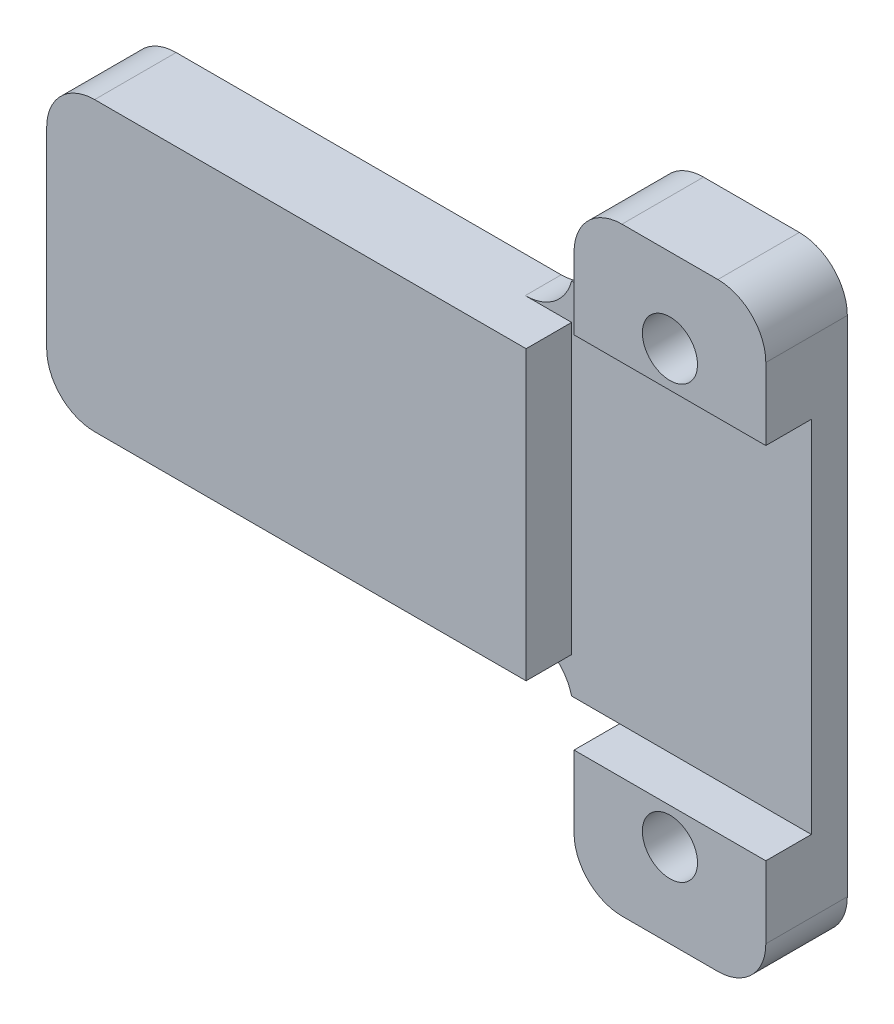
ISO-10303-21;
HEADER;
FILE_DESCRIPTION(('STEP AP214'),'2;1');
FILE_NAME('part.step','',(''),(''),'','','');
FILE_SCHEMA(('AUTOMOTIVE_DESIGN { 1 0 10303 214 1 1 1 1 }'));
ENDSEC;
DATA;
#1=APPLICATION_CONTEXT('core data for automotive mechanical design processes');
#2=APPLICATION_PROTOCOL_DEFINITION('international standard','automotive_design',2000,#1);
#3=PRODUCT_CONTEXT('',#1,'mechanical');
#4=PRODUCT('Part','Part','',(#3));
#5=PRODUCT_RELATED_PRODUCT_CATEGORY('part','',(#4));
#6=PRODUCT_DEFINITION_FORMATION('','',#4);
#7=PRODUCT_DEFINITION_CONTEXT('part definition',#1,'design');
#8=PRODUCT_DEFINITION('design','',#6,#7);
#9=PRODUCT_DEFINITION_SHAPE('','',#8);
#10=(LENGTH_UNIT() NAMED_UNIT(*) SI_UNIT(.MILLI.,.METRE.));
#11=(NAMED_UNIT(*) PLANE_ANGLE_UNIT() SI_UNIT($,.RADIAN.));
#12=(NAMED_UNIT(*) SI_UNIT($,.STERADIAN.) SOLID_ANGLE_UNIT());
#13=UNCERTAINTY_MEASURE_WITH_UNIT(LENGTH_MEASURE(1.E-05),#10,'distance_accuracy_value','');
#14=(GEOMETRIC_REPRESENTATION_CONTEXT(3) GLOBAL_UNCERTAINTY_ASSIGNED_CONTEXT((#13)) GLOBAL_UNIT_ASSIGNED_CONTEXT((#10,
#11,#12)) REPRESENTATION_CONTEXT('',''));
#15=CARTESIAN_POINT('',(0.,0.,0.));
#16=DIRECTION('',(0.,0.,1.));
#17=DIRECTION('',(1.,0.,0.));
#18=AXIS2_PLACEMENT_3D('',#15,#16,#17);
#19=CARTESIAN_POINT('',(30.,-7.5,1.5));
#20=DIRECTION('',(0.,1.,0.));
#21=DIRECTION('',(-1.,0.,0.));
#22=AXIS2_PLACEMENT_3D('',#19,#20,#21);
#23=PLANE('',#22);
#24=DIRECTION('',(0.,0.,-1.));
#25=VECTOR('',#24,1.);
#26=CARTESIAN_POINT('',(22.,-7.5,3.4));
#27=LINE('',#26,#25);
#28=CARTESIAN_POINT('',(22.,-7.5,1.5));
#29=VERTEX_POINT('',#28);
#30=CARTESIAN_POINT('',(22.,-7.5,0.));
#31=VERTEX_POINT('',#30);
#32=EDGE_CURVE('E225',#29,#31,#27,.T.);
#33=ORIENTED_EDGE('',*,*,#32,.F.);
#34=DIRECTION('',(1.,0.,0.));
#35=VECTOR('',#34,1.);
#36=CARTESIAN_POINT('',(30.,-7.5,1.5));
#37=LINE('',#36,#35);
#38=CARTESIAN_POINT('',(20.,-7.5,1.5));
#39=VERTEX_POINT('',#38);
#40=EDGE_CURVE('E361',#39,#29,#37,.T.);
#41=ORIENTED_EDGE('',*,*,#40,.F.);
#42=DIRECTION('',(0.,0.,-1.));
#43=VECTOR('',#42,1.);
#44=CARTESIAN_POINT('',(20.,-7.5,1.5));
#45=LINE('',#44,#43);
#46=CARTESIAN_POINT('',(20.,-7.5,0.));
#47=VERTEX_POINT('',#46);
#48=EDGE_CURVE('E384',#39,#47,#45,.T.);
#49=ORIENTED_EDGE('',*,*,#48,.T.);
#50=DIRECTION('',(1.,0.,0.));
#51=VECTOR('',#50,1.);
#52=CARTESIAN_POINT('',(30.,-7.5,0.));
#53=LINE('',#52,#51);
#54=EDGE_CURVE('E263',#47,#31,#53,.T.);
#55=ORIENTED_EDGE('',*,*,#54,.T.);
#56=EDGE_LOOP('',(#33,#41,#49,#55));
#57=FACE_BOUND('',#56,.T.);
#58=ADVANCED_FACE('F39',(#57),#23,.F.);
#59=CARTESIAN_POINT('',(20.,6.,3.4));
#60=DIRECTION('',(-1.,0.,0.));
#61=DIRECTION('',(0.,0.,1.));
#62=AXIS2_PLACEMENT_3D('',#59,#60,#61);
#63=PLANE('',#62);
#64=DIRECTION('',(0.,-1.,0.));
#65=VECTOR('',#64,1.);
#66=CARTESIAN_POINT('',(20.,6.,1.5));
#67=LINE('',#66,#65);
#68=CARTESIAN_POINT('',(20.,6.,1.5));
#69=VERTEX_POINT('',#68);
#70=CARTESIAN_POINT('',(20.,-6.,1.5));
#71=VERTEX_POINT('',#70);
#72=EDGE_CURVE('E422',#69,#71,#67,.T.);
#73=ORIENTED_EDGE('',*,*,#72,.F.);
#74=DIRECTION('',(0.,0.,-1.));
#75=VECTOR('',#74,1.);
#76=CARTESIAN_POINT('',(20.,6.,3.4));
#77=LINE('',#76,#75);
#78=CARTESIAN_POINT('',(20.,6.,3.4));
#79=VERTEX_POINT('',#78);
#80=EDGE_CURVE('E404',#79,#69,#77,.T.);
#81=ORIENTED_EDGE('',*,*,#80,.F.);
#82=DIRECTION('',(0.,1.,0.));
#83=VECTOR('',#82,1.);
#84=CARTESIAN_POINT('',(20.,6.,3.4));
#85=LINE('',#84,#83);
#86=CARTESIAN_POINT('',(20.,-6.,3.4));
#87=VERTEX_POINT('',#86);
#88=EDGE_CURVE('E397',#87,#79,#85,.T.);
#89=ORIENTED_EDGE('',*,*,#88,.F.);
#90=DIRECTION('',(0.,0.,-1.));
#91=VECTOR('',#90,1.);
#92=CARTESIAN_POINT('',(20.,-6.,3.4));
#93=LINE('',#92,#91);
#94=EDGE_CURVE('E418',#87,#71,#93,.T.);
#95=ORIENTED_EDGE('',*,*,#94,.T.);
#96=EDGE_LOOP('',(#73,#81,#89,#95));
#97=FACE_BOUND('',#96,.T.);
#98=ADVANCED_FACE('F514',(#97),#63,.F.);
#99=CARTESIAN_POINT('',(0.,-6.,3.4));
#100=DIRECTION('',(0.,1.,0.));
#101=DIRECTION('',(0.,0.,1.));
#102=AXIS2_PLACEMENT_3D('',#99,#100,#101);
#103=PLANE('',#102);
#104=DIRECTION('',(1.,0.,0.));
#105=VECTOR('',#104,1.);
#106=CARTESIAN_POINT('',(0.,-6.,0.));
#107=LINE('',#106,#105);
#108=CARTESIAN_POINT('',(2.,-6.,0.));
#109=VERTEX_POINT('',#108);
#110=CARTESIAN_POINT('',(18.0635083268963,-6.,0.));
#111=VERTEX_POINT('',#110);
#112=EDGE_CURVE('E388',#109,#111,#107,.T.);
#113=ORIENTED_EDGE('',*,*,#112,.T.);
#114=DIRECTION('',(0.,0.,1.));
#115=VECTOR('',#114,1.);
#116=CARTESIAN_POINT('',(18.0635083268963,-6.,3.4));
#117=LINE('',#116,#115);
#118=CARTESIAN_POINT('',(18.0635083268963,-6.,1.5));
#119=VERTEX_POINT('',#118);
#120=EDGE_CURVE('E430',#111,#119,#117,.T.);
#121=ORIENTED_EDGE('',*,*,#120,.T.);
#122=DIRECTION('',(1.,0.,0.));
#123=VECTOR('',#122,1.);
#124=CARTESIAN_POINT('',(0.,-6.,1.5));
#125=LINE('',#124,#123);
#126=EDGE_CURVE('E427',#119,#71,#125,.T.);
#127=ORIENTED_EDGE('',*,*,#126,.T.);
#128=ORIENTED_EDGE('',*,*,#94,.F.);
#129=DIRECTION('',(1.,0.,0.));
#130=VECTOR('',#129,1.);
#131=CARTESIAN_POINT('',(0.,-6.,3.4));
#132=LINE('',#131,#130);
#133=CARTESIAN_POINT('',(2.,-6.,3.4));
#134=VERTEX_POINT('',#133);
#135=EDGE_CURVE('E393',#134,#87,#132,.T.);
#136=ORIENTED_EDGE('',*,*,#135,.F.);
#137=DIRECTION('',(0.,0.,-1.));
#138=VECTOR('',#137,1.);
#139=CARTESIAN_POINT('',(2.,-6.,3.4));
#140=LINE('',#139,#138);
#141=EDGE_CURVE('E423',#134,#109,#140,.T.);
#142=ORIENTED_EDGE('',*,*,#141,.T.);
#143=EDGE_LOOP('',(#113,#121,#127,#128,#136,#142));
#144=FACE_BOUND('',#143,.T.);
#145=ADVANCED_FACE('F521',(#144),#103,.F.);
#146=CARTESIAN_POINT('',(0.,6.,3.4));
#147=DIRECTION('',(0.,-1.,0.));
#148=DIRECTION('',(0.,0.,-1.));
#149=AXIS2_PLACEMENT_3D('',#146,#147,#148);
#150=PLANE('',#149);
#151=DIRECTION('',(-1.,0.,0.));
#152=VECTOR('',#151,1.);
#153=CARTESIAN_POINT('',(0.,6.,1.5));
#154=LINE('',#153,#152);
#155=CARTESIAN_POINT('',(18.0635083268963,6.,1.5));
#156=VERTEX_POINT('',#155);
#157=EDGE_CURVE('E437',#69,#156,#154,.T.);
#158=ORIENTED_EDGE('',*,*,#157,.T.);
#159=DIRECTION('',(0.,0.,-1.));
#160=VECTOR('',#159,1.);
#161=CARTESIAN_POINT('',(18.0635083268963,6.,3.4));
#162=LINE('',#161,#160);
#163=CARTESIAN_POINT('',(18.0635083268963,6.,0.));
#164=VERTEX_POINT('',#163);
#165=EDGE_CURVE('E441',#156,#164,#162,.T.);
#166=ORIENTED_EDGE('',*,*,#165,.T.);
#167=DIRECTION('',(-1.,0.,0.));
#168=VECTOR('',#167,1.);
#169=CARTESIAN_POINT('',(0.,6.,0.));
#170=LINE('',#169,#168);
#171=CARTESIAN_POINT('',(2.,6.,0.));
#172=VERTEX_POINT('',#171);
#173=EDGE_CURVE('E408',#164,#172,#170,.T.);
#174=ORIENTED_EDGE('',*,*,#173,.T.);
#175=DIRECTION('',(0.,0.,-1.));
#176=VECTOR('',#175,1.);
#177=CARTESIAN_POINT('',(2.,6.,3.4));
#178=LINE('',#177,#176);
#179=CARTESIAN_POINT('',(2.,6.,3.4));
#180=VERTEX_POINT('',#179);
#181=EDGE_CURVE('E434',#172,#180,#178,.F.);
#182=ORIENTED_EDGE('',*,*,#181,.T.);
#183=DIRECTION('',(-1.,0.,0.));
#184=VECTOR('',#183,1.);
#185=CARTESIAN_POINT('',(0.,6.,3.4));
#186=LINE('',#185,#184);
#187=EDGE_CURVE('E400',#79,#180,#186,.T.);
#188=ORIENTED_EDGE('',*,*,#187,.F.);
#189=ORIENTED_EDGE('',*,*,#80,.T.);
#190=EDGE_LOOP('',(#158,#166,#174,#182,#188,#189));
#191=FACE_BOUND('',#190,.T.);
#192=ADVANCED_FACE('F508',(#191),#150,.F.);
#193=CARTESIAN_POINT('',(0.,0.,3.4));
#194=DIRECTION('',(1.,0.,0.));
#195=DIRECTION('',(0.,0.,-1.));
#196=AXIS2_PLACEMENT_3D('',#193,#194,#195);
#197=PLANE('',#196);
#198=DIRECTION('',(0.,-1.,0.));
#199=VECTOR('',#198,1.);
#200=CARTESIAN_POINT('',(0.,0.,0.));
#201=LINE('',#200,#199);
#202=CARTESIAN_POINT('',(0.,4.,0.));
#203=VERTEX_POINT('',#202);
#204=CARTESIAN_POINT('',(0.,-4.,0.));
#205=VERTEX_POINT('',#204);
#206=EDGE_CURVE('E394',#203,#205,#201,.T.);
#207=ORIENTED_EDGE('',*,*,#206,.T.);
#208=DIRECTION('',(0.,0.,-1.));
#209=VECTOR('',#208,1.);
#210=CARTESIAN_POINT('',(0.,-4.,3.4));
#211=LINE('',#210,#209);
#212=CARTESIAN_POINT('',(0.,-4.,3.4));
#213=VERTEX_POINT('',#212);
#214=EDGE_CURVE('E455',#205,#213,#211,.F.);
#215=ORIENTED_EDGE('',*,*,#214,.T.);
#216=DIRECTION('',(0.,-1.,0.));
#217=VECTOR('',#216,1.);
#218=CARTESIAN_POINT('',(0.,0.,3.4));
#219=LINE('',#218,#217);
#220=CARTESIAN_POINT('',(0.,4.,3.4));
#221=VERTEX_POINT('',#220);
#222=EDGE_CURVE('E389',#221,#213,#219,.T.);
#223=ORIENTED_EDGE('',*,*,#222,.F.);
#224=DIRECTION('',(0.,0.,-1.));
#225=VECTOR('',#224,1.);
#226=CARTESIAN_POINT('',(0.,4.,3.4));
#227=LINE('',#226,#225);
#228=EDGE_CURVE('E451',#221,#203,#227,.T.);
#229=ORIENTED_EDGE('',*,*,#228,.T.);
#230=EDGE_LOOP('',(#207,#215,#223,#229));
#231=FACE_BOUND('',#230,.T.);
#232=ADVANCED_FACE('F550',(#231),#197,.F.);
#233=CARTESIAN_POINT('',(0.,0.,3.4));
#234=DIRECTION('',(0.,0.,1.));
#235=DIRECTION('',(1.,0.,0.));
#236=AXIS2_PLACEMENT_3D('',#233,#234,#235);
#237=PLANE('',#236);
#238=ORIENTED_EDGE('',*,*,#222,.T.);
#239=CARTESIAN_POINT('',(2.,-4.,3.4));
#240=DIRECTION('',(0.,0.,1.));
#241=DIRECTION('',(1.,0.,0.));
#242=AXIS2_PLACEMENT_3D('',#239,#240,#241);
#243=CIRCLE('',#242,2.);
#244=EDGE_CURVE('E461',#213,#134,#243,.T.);
#245=ORIENTED_EDGE('',*,*,#244,.T.);
#246=ORIENTED_EDGE('',*,*,#135,.T.);
#247=ORIENTED_EDGE('',*,*,#88,.T.);
#248=ORIENTED_EDGE('',*,*,#187,.T.);
#249=CARTESIAN_POINT('',(2.,4.,3.4));
#250=DIRECTION('',(0.,0.,1.));
#251=DIRECTION('',(1.,0.,0.));
#252=AXIS2_PLACEMENT_3D('',#249,#250,#251);
#253=CIRCLE('',#252,2.);
#254=EDGE_CURVE('E458',#180,#221,#253,.T.);
#255=ORIENTED_EDGE('',*,*,#254,.T.);
#256=EDGE_LOOP('',(#238,#245,#246,#247,#248,#255));
#257=FACE_BOUND('',#256,.T.);
#258=ADVANCED_FACE('F547',(#257),#237,.T.);
#259=CARTESIAN_POINT('',(0.,0.,0.));
#260=DIRECTION('',(0.,0.,1.));
#261=DIRECTION('',(1.,0.,0.));
#262=AXIS2_PLACEMENT_3D('',#259,#260,#261);
#263=PLANE('',#262);
#264=CARTESIAN_POINT('',(26.,9.,0.));
#265=DIRECTION('',(0.,0.,1.));
#266=DIRECTION('',(1.,0.,0.));
#267=AXIS2_PLACEMENT_3D('',#264,#265,#266);
#268=CIRCLE('',#267,1.15);
#269=CARTESIAN_POINT('',(27.15,9.,0.));
#270=VERTEX_POINT('',#269);
#271=EDGE_CURVE('E317',#270,#270,#268,.T.);
#272=ORIENTED_EDGE('',*,*,#271,.T.);
#273=EDGE_LOOP('',(#272));
#274=FACE_BOUND('',#273,.T.);
#275=CARTESIAN_POINT('',(26.,-9.,0.));
#276=DIRECTION('',(0.,0.,1.));
#277=DIRECTION('',(1.,0.,0.));
#278=AXIS2_PLACEMENT_3D('',#275,#276,#277);
#279=CIRCLE('',#278,1.15);
#280=CARTESIAN_POINT('',(27.15,-9.,0.));
#281=VERTEX_POINT('',#280);
#282=EDGE_CURVE('E325',#281,#281,#279,.T.);
#283=ORIENTED_EDGE('',*,*,#282,.T.);
#284=EDGE_LOOP('',(#283));
#285=FACE_BOUND('',#284,.T.);
#286=DIRECTION('',(-1.,0.,0.));
#287=VECTOR('',#286,1.);
#288=CARTESIAN_POINT('',(22.,12.5,0.));
#289=LINE('',#288,#287);
#290=CARTESIAN_POINT('',(28.,12.5,0.));
#291=VERTEX_POINT('',#290);
#292=CARTESIAN_POINT('',(24.,12.5,0.));
#293=VERTEX_POINT('',#292);
#294=EDGE_CURVE('E222',#291,#293,#289,.T.);
#295=ORIENTED_EDGE('',*,*,#294,.F.);
#296=CARTESIAN_POINT('',(28.,10.5,0.));
#297=DIRECTION('',(0.,0.,1.));
#298=DIRECTION('',(1.,0.,0.));
#299=AXIS2_PLACEMENT_3D('',#296,#297,#298);
#300=CIRCLE('',#299,2.);
#301=CARTESIAN_POINT('',(30.,10.5,0.));
#302=VERTEX_POINT('',#301);
#303=EDGE_CURVE('E483',#291,#302,#300,.F.);
#304=ORIENTED_EDGE('',*,*,#303,.T.);
#305=DIRECTION('',(0.,1.,0.));
#306=VECTOR('',#305,1.);
#307=CARTESIAN_POINT('',(30.,7.5,0.));
#308=LINE('',#307,#306);
#309=CARTESIAN_POINT('',(30.,-10.5,0.));
#310=VERTEX_POINT('',#309);
#311=EDGE_CURVE('E375',#310,#302,#308,.T.);
#312=ORIENTED_EDGE('',*,*,#311,.F.);
#313=CARTESIAN_POINT('',(28.,-10.5,0.));
#314=DIRECTION('',(0.,0.,1.));
#315=DIRECTION('',(1.,0.,0.));
#316=AXIS2_PLACEMENT_3D('',#313,#314,#315);
#317=CIRCLE('',#316,2.);
#318=CARTESIAN_POINT('',(28.,-12.5,0.));
#319=VERTEX_POINT('',#318);
#320=EDGE_CURVE('E348',#310,#319,#317,.F.);
#321=ORIENTED_EDGE('',*,*,#320,.T.);
#322=DIRECTION('',(1.,0.,0.));
#323=VECTOR('',#322,1.);
#324=CARTESIAN_POINT('',(22.,-12.5,0.));
#325=LINE('',#324,#323);
#326=CARTESIAN_POINT('',(24.,-12.5,0.));
#327=VERTEX_POINT('',#326);
#328=EDGE_CURVE('E216',#327,#319,#325,.T.);
#329=ORIENTED_EDGE('',*,*,#328,.F.);
#330=CARTESIAN_POINT('',(24.,-10.5,0.));
#331=DIRECTION('',(0.,0.,1.));
#332=DIRECTION('',(1.,0.,0.));
#333=AXIS2_PLACEMENT_3D('',#330,#331,#332);
#334=CIRCLE('',#333,2.);
#335=CARTESIAN_POINT('',(22.,-10.5,0.));
#336=VERTEX_POINT('',#335);
#337=EDGE_CURVE('E475',#327,#336,#334,.F.);
#338=ORIENTED_EDGE('',*,*,#337,.T.);
#339=DIRECTION('',(0.,-1.,0.));
#340=VECTOR('',#339,1.);
#341=CARTESIAN_POINT('',(22.,-7.5,0.));
#342=LINE('',#341,#340);
#343=EDGE_CURVE('E323',#31,#336,#342,.T.);
#344=ORIENTED_EDGE('',*,*,#343,.F.);
#345=ORIENTED_EDGE('',*,*,#54,.F.);
#346=CARTESIAN_POINT('',(18.0635083268963,-8.,0.));
#347=DIRECTION('',(0.,0.,1.));
#348=DIRECTION('',(1.,0.,0.));
#349=AXIS2_PLACEMENT_3D('',#346,#347,#348);
#350=CIRCLE('',#349,2.);
#351=EDGE_CURVE('E464',#47,#111,#350,.T.);
#352=ORIENTED_EDGE('',*,*,#351,.T.);
#353=ORIENTED_EDGE('',*,*,#112,.F.);
#354=CARTESIAN_POINT('',(2.,-4.,0.));
#355=DIRECTION('',(0.,0.,1.));
#356=DIRECTION('',(1.,0.,0.));
#357=AXIS2_PLACEMENT_3D('',#354,#355,#356);
#358=CIRCLE('',#357,2.);
#359=EDGE_CURVE('E448',#109,#205,#358,.F.);
#360=ORIENTED_EDGE('',*,*,#359,.T.);
#361=ORIENTED_EDGE('',*,*,#206,.F.);
#362=CARTESIAN_POINT('',(2.,4.,0.));
#363=DIRECTION('',(0.,0.,1.));
#364=DIRECTION('',(1.,0.,0.));
#365=AXIS2_PLACEMENT_3D('',#362,#363,#364);
#366=CIRCLE('',#365,2.);
#367=EDGE_CURVE('E445',#203,#172,#366,.F.);
#368=ORIENTED_EDGE('',*,*,#367,.T.);
#369=ORIENTED_EDGE('',*,*,#173,.F.);
#370=CARTESIAN_POINT('',(18.0635083268963,8.,0.));
#371=DIRECTION('',(0.,0.,1.));
#372=DIRECTION('',(1.,0.,0.));
#373=AXIS2_PLACEMENT_3D('',#370,#371,#372);
#374=CIRCLE('',#373,2.);
#375=CARTESIAN_POINT('',(20.,7.5,0.));
#376=VERTEX_POINT('',#375);
#377=EDGE_CURVE('E249',#164,#376,#374,.T.);
#378=ORIENTED_EDGE('',*,*,#377,.T.);
#379=DIRECTION('',(-1.,0.,0.));
#380=VECTOR('',#379,1.);
#381=CARTESIAN_POINT('',(20.,7.5,0.));
#382=LINE('',#381,#380);
#383=CARTESIAN_POINT('',(22.,7.5,0.));
#384=VERTEX_POINT('',#383);
#385=EDGE_CURVE('E378',#384,#376,#382,.T.);
#386=ORIENTED_EDGE('',*,*,#385,.F.);
#387=DIRECTION('',(0.,-1.,0.));
#388=VECTOR('',#387,1.);
#389=CARTESIAN_POINT('',(22.,7.5,0.));
#390=LINE('',#389,#388);
#391=CARTESIAN_POINT('',(22.,10.5,0.));
#392=VERTEX_POINT('',#391);
#393=EDGE_CURVE('E229',#392,#384,#390,.T.);
#394=ORIENTED_EDGE('',*,*,#393,.F.);
#395=CARTESIAN_POINT('',(24.,10.5,0.));
#396=DIRECTION('',(0.,0.,1.));
#397=DIRECTION('',(1.,0.,0.));
#398=AXIS2_PLACEMENT_3D('',#395,#396,#397);
#399=CIRCLE('',#398,2.);
#400=EDGE_CURVE('E480',#392,#293,#399,.F.);
#401=ORIENTED_EDGE('',*,*,#400,.T.);
#402=EDGE_LOOP('',(#295,#304,#312,#321,#329,#338,#344,#345,#352,#353,#360,#361,#368,#369,#378,
#386,#394,#401));
#403=FACE_BOUND('',#402,.T.);
#404=ADVANCED_FACE('F489',(#274,#285,#403),#263,.F.);
#405=CARTESIAN_POINT('',(30.,7.5,1.5));
#406=DIRECTION('',(-1.,0.,0.));
#407=DIRECTION('',(0.,-1.,0.));
#408=AXIS2_PLACEMENT_3D('',#405,#406,#407);
#409=PLANE('',#408);
#410=ORIENTED_EDGE('',*,*,#311,.T.);
#411=DIRECTION('',(0.,0.,-1.));
#412=VECTOR('',#411,1.);
#413=CARTESIAN_POINT('',(30.,10.5,1.5));
#414=LINE('',#413,#412);
#415=CARTESIAN_POINT('',(30.,10.5,3.4));
#416=VERTEX_POINT('',#415);
#417=EDGE_CURVE('E292',#302,#416,#414,.F.);
#418=ORIENTED_EDGE('',*,*,#417,.T.);
#419=DIRECTION('',(0.,1.,0.));
#420=VECTOR('',#419,1.);
#421=CARTESIAN_POINT('',(30.,12.5,3.4));
#422=LINE('',#421,#420);
#423=CARTESIAN_POINT('',(30.,7.5,3.4));
#424=VERTEX_POINT('',#423);
#425=EDGE_CURVE('E271',#424,#416,#422,.T.);
#426=ORIENTED_EDGE('',*,*,#425,.F.);
#427=DIRECTION('',(0.,0.,-1.));
#428=VECTOR('',#427,1.);
#429=CARTESIAN_POINT('',(30.,7.5,3.4));
#430=LINE('',#429,#428);
#431=CARTESIAN_POINT('',(30.,7.5,1.5));
#432=VERTEX_POINT('',#431);
#433=EDGE_CURVE('E255',#424,#432,#430,.T.);
#434=ORIENTED_EDGE('',*,*,#433,.T.);
#435=DIRECTION('',(0.,1.,0.));
#436=VECTOR('',#435,1.);
#437=CARTESIAN_POINT('',(30.,7.5,1.5));
#438=LINE('',#437,#436);
#439=CARTESIAN_POINT('',(30.,-7.5,1.5));
#440=VERTEX_POINT('',#439);
#441=EDGE_CURVE('E356',#440,#432,#438,.T.);
#442=ORIENTED_EDGE('',*,*,#441,.F.);
#443=DIRECTION('',(0.,0.,-1.));
#444=VECTOR('',#443,1.);
#445=CARTESIAN_POINT('',(30.,-7.5,3.4));
#446=LINE('',#445,#444);
#447=CARTESIAN_POINT('',(30.,-7.5,3.4));
#448=VERTEX_POINT('',#447);
#449=EDGE_CURVE('E223',#448,#440,#446,.T.);
#450=ORIENTED_EDGE('',*,*,#449,.F.);
#451=DIRECTION('',(0.,1.,0.));
#452=VECTOR('',#451,1.);
#453=CARTESIAN_POINT('',(30.,-12.5,3.4));
#454=LINE('',#453,#452);
#455=CARTESIAN_POINT('',(30.,-10.5,3.4));
#456=VERTEX_POINT('',#455);
#457=EDGE_CURVE('E211',#456,#448,#454,.T.);
#458=ORIENTED_EDGE('',*,*,#457,.F.);
#459=DIRECTION('',(0.,0.,-1.));
#460=VECTOR('',#459,1.);
#461=CARTESIAN_POINT('',(30.,-10.5,1.5));
#462=LINE('',#461,#460);
#463=EDGE_CURVE('E350',#456,#310,#462,.T.);
#464=ORIENTED_EDGE('',*,*,#463,.T.);
#465=EDGE_LOOP('',(#410,#418,#426,#434,#442,#450,#458,#464));
#466=FACE_BOUND('',#465,.T.);
#467=ADVANCED_FACE('F352',(#466),#409,.F.);
#468=CARTESIAN_POINT('',(20.,7.5,1.5));
#469=DIRECTION('',(0.,-1.,0.));
#470=DIRECTION('',(0.,0.,-1.));
#471=AXIS2_PLACEMENT_3D('',#468,#469,#470);
#472=PLANE('',#471);
#473=DIRECTION('',(-1.,0.,0.));
#474=VECTOR('',#473,1.);
#475=CARTESIAN_POINT('',(20.,7.5,1.5));
#476=LINE('',#475,#474);
#477=CARTESIAN_POINT('',(22.,7.5,1.5));
#478=VERTEX_POINT('',#477);
#479=CARTESIAN_POINT('',(20.,7.5,1.5));
#480=VERTEX_POINT('',#479);
#481=EDGE_CURVE('E360',#478,#480,#476,.T.);
#482=ORIENTED_EDGE('',*,*,#481,.F.);
#483=DIRECTION('',(0.,0.,-1.));
#484=VECTOR('',#483,1.);
#485=CARTESIAN_POINT('',(22.,7.5,3.4));
#486=LINE('',#485,#484);
#487=EDGE_CURVE('E235',#478,#384,#486,.T.);
#488=ORIENTED_EDGE('',*,*,#487,.T.);
#489=ORIENTED_EDGE('',*,*,#385,.T.);
#490=DIRECTION('',(0.,0.,-1.));
#491=VECTOR('',#490,1.);
#492=CARTESIAN_POINT('',(20.,7.5,1.5));
#493=LINE('',#492,#491);
#494=EDGE_CURVE('E372',#480,#376,#493,.T.);
#495=ORIENTED_EDGE('',*,*,#494,.F.);
#496=EDGE_LOOP('',(#482,#488,#489,#495));
#497=FACE_BOUND('',#496,.T.);
#498=ADVANCED_FACE('F500',(#497),#472,.F.);
#499=CARTESIAN_POINT('',(0.,0.,1.5));
#500=DIRECTION('',(0.,0.,-1.));
#501=DIRECTION('',(-1.,0.,0.));
#502=AXIS2_PLACEMENT_3D('',#499,#500,#501);
#503=PLANE('',#502);
#504=EDGE_CURVE('E365',#432,#478,#476,.T.);
#505=ORIENTED_EDGE('',*,*,#504,.T.);
#506=ORIENTED_EDGE('',*,*,#481,.T.);
#507=CARTESIAN_POINT('',(18.0635083268963,8.,1.5));
#508=DIRECTION('',(0.,0.,-1.));
#509=DIRECTION('',(-1.,0.,0.));
#510=AXIS2_PLACEMENT_3D('',#507,#508,#509);
#511=CIRCLE('',#510,2.);
#512=EDGE_CURVE('E242',#480,#156,#511,.T.);
#513=ORIENTED_EDGE('',*,*,#512,.T.);
#514=ORIENTED_EDGE('',*,*,#157,.F.);
#515=ORIENTED_EDGE('',*,*,#72,.T.);
#516=ORIENTED_EDGE('',*,*,#126,.F.);
#517=CARTESIAN_POINT('',(18.0635083268963,-8.,1.5));
#518=DIRECTION('',(0.,0.,-1.));
#519=DIRECTION('',(-1.,0.,0.));
#520=AXIS2_PLACEMENT_3D('',#517,#518,#519);
#521=CIRCLE('',#520,2.);
#522=EDGE_CURVE('E467',#119,#39,#521,.T.);
#523=ORIENTED_EDGE('',*,*,#522,.T.);
#524=ORIENTED_EDGE('',*,*,#40,.T.);
#525=EDGE_CURVE('E220',#29,#440,#37,.T.);
#526=ORIENTED_EDGE('',*,*,#525,.T.);
#527=ORIENTED_EDGE('',*,*,#441,.T.);
#528=EDGE_LOOP('',(#505,#506,#513,#514,#515,#516,#523,#524,#526,#527));
#529=FACE_BOUND('',#528,.T.);
#530=ADVANCED_FACE('F505',(#529),#503,.F.);
#531=CARTESIAN_POINT('',(18.0635083268963,-8.,1.5));
#532=DIRECTION('',(0.,0.,1.));
#533=DIRECTION('',(1.,0.,0.));
#534=AXIS2_PLACEMENT_3D('',#531,#532,#533);
#535=CYLINDRICAL_SURFACE('',#534,2.);
#536=ORIENTED_EDGE('',*,*,#522,.F.);
#537=ORIENTED_EDGE('',*,*,#120,.F.);
#538=ORIENTED_EDGE('',*,*,#351,.F.);
#539=ORIENTED_EDGE('',*,*,#48,.F.);
#540=EDGE_LOOP('',(#536,#537,#538,#539));
#541=FACE_BOUND('',#540,.T.);
#542=ADVANCED_FACE('F525',(#541),#535,.F.);
#543=CARTESIAN_POINT('',(18.0635083268963,8.,1.5));
#544=DIRECTION('',(0.,0.,-1.));
#545=DIRECTION('',(-1.,0.,0.));
#546=AXIS2_PLACEMENT_3D('',#543,#544,#545);
#547=CYLINDRICAL_SURFACE('',#546,2.);
#548=ORIENTED_EDGE('',*,*,#512,.F.);
#549=ORIENTED_EDGE('',*,*,#494,.T.);
#550=ORIENTED_EDGE('',*,*,#377,.F.);
#551=ORIENTED_EDGE('',*,*,#165,.F.);
#552=EDGE_LOOP('',(#548,#549,#550,#551));
#553=FACE_BOUND('',#552,.T.);
#554=ADVANCED_FACE('F504',(#553),#547,.F.);
#555=CARTESIAN_POINT('',(2.,-4.,3.4));
#556=DIRECTION('',(0.,0.,-1.));
#557=DIRECTION('',(-1.,0.,0.));
#558=AXIS2_PLACEMENT_3D('',#555,#556,#557);
#559=CYLINDRICAL_SURFACE('',#558,2.);
#560=ORIENTED_EDGE('',*,*,#244,.F.);
#561=ORIENTED_EDGE('',*,*,#214,.F.);
#562=ORIENTED_EDGE('',*,*,#359,.F.);
#563=ORIENTED_EDGE('',*,*,#141,.F.);
#564=EDGE_LOOP('',(#560,#561,#562,#563));
#565=FACE_BOUND('',#564,.T.);
#566=ADVANCED_FACE('F565',(#565),#559,.T.);
#567=CARTESIAN_POINT('',(2.,4.,3.4));
#568=DIRECTION('',(0.,0.,-1.));
#569=DIRECTION('',(-1.,0.,0.));
#570=AXIS2_PLACEMENT_3D('',#567,#568,#569);
#571=CYLINDRICAL_SURFACE('',#570,2.);
#572=ORIENTED_EDGE('',*,*,#254,.F.);
#573=ORIENTED_EDGE('',*,*,#181,.F.);
#574=ORIENTED_EDGE('',*,*,#367,.F.);
#575=ORIENTED_EDGE('',*,*,#228,.F.);
#576=EDGE_LOOP('',(#572,#573,#574,#575));
#577=FACE_BOUND('',#576,.T.);
#578=ADVANCED_FACE('F568',(#577),#571,.T.);
#579=CARTESIAN_POINT('',(22.,7.5,3.4));
#580=DIRECTION('',(0.,1.,0.));
#581=DIRECTION('',(0.,0.,1.));
#582=AXIS2_PLACEMENT_3D('',#579,#580,#581);
#583=PLANE('',#582);
#584=ORIENTED_EDGE('',*,*,#504,.F.);
#585=ORIENTED_EDGE('',*,*,#433,.F.);
#586=DIRECTION('',(1.,0.,0.));
#587=VECTOR('',#586,1.);
#588=CARTESIAN_POINT('',(22.,7.5,3.4));
#589=LINE('',#588,#587);
#590=CARTESIAN_POINT('',(22.,7.5,3.4));
#591=VERTEX_POINT('',#590);
#592=EDGE_CURVE('E275',#591,#424,#589,.T.);
#593=ORIENTED_EDGE('',*,*,#592,.F.);
#594=EDGE_CURVE('E244',#591,#478,#486,.T.);
#595=ORIENTED_EDGE('',*,*,#594,.T.);
#596=EDGE_LOOP('',(#584,#585,#593,#595));
#597=FACE_BOUND('',#596,.T.);
#598=ADVANCED_FACE('F572',(#597),#583,.F.);
#599=CARTESIAN_POINT('',(22.,12.5,3.4));
#600=DIRECTION('',(0.,-1.,0.));
#601=DIRECTION('',(0.,0.,-1.));
#602=AXIS2_PLACEMENT_3D('',#599,#600,#601);
#603=PLANE('',#602);
#604=DIRECTION('',(-1.,0.,0.));
#605=VECTOR('',#604,1.);
#606=CARTESIAN_POINT('',(22.,12.5,3.4));
#607=LINE('',#606,#605);
#608=CARTESIAN_POINT('',(28.,12.5,3.4));
#609=VERTEX_POINT('',#608);
#610=CARTESIAN_POINT('',(24.,12.5,3.4));
#611=VERTEX_POINT('',#610);
#612=EDGE_CURVE('E264',#609,#611,#607,.T.);
#613=ORIENTED_EDGE('',*,*,#612,.F.);
#614=DIRECTION('',(0.,0.,-1.));
#615=VECTOR('',#614,1.);
#616=CARTESIAN_POINT('',(28.,12.5,3.4));
#617=LINE('',#616,#615);
#618=EDGE_CURVE('E239',#609,#291,#617,.T.);
#619=ORIENTED_EDGE('',*,*,#618,.T.);
#620=ORIENTED_EDGE('',*,*,#294,.T.);
#621=DIRECTION('',(0.,0.,-1.));
#622=VECTOR('',#621,1.);
#623=CARTESIAN_POINT('',(24.,12.5,3.4));
#624=LINE('',#623,#622);
#625=EDGE_CURVE('E234',#293,#611,#624,.F.);
#626=ORIENTED_EDGE('',*,*,#625,.T.);
#627=EDGE_LOOP('',(#613,#619,#620,#626));
#628=FACE_BOUND('',#627,.T.);
#629=ADVANCED_FACE('F491',(#628),#603,.F.);
#630=CARTESIAN_POINT('',(22.,7.5,3.4));
#631=DIRECTION('',(1.,0.,0.));
#632=DIRECTION('',(0.,0.,-1.));
#633=AXIS2_PLACEMENT_3D('',#630,#631,#632);
#634=PLANE('',#633);
#635=DIRECTION('',(0.,-1.,0.));
#636=VECTOR('',#635,1.);
#637=CARTESIAN_POINT('',(22.,7.5,3.4));
#638=LINE('',#637,#636);
#639=CARTESIAN_POINT('',(22.,10.5,3.4));
#640=VERTEX_POINT('',#639);
#641=EDGE_CURVE('E256',#640,#591,#638,.T.);
#642=ORIENTED_EDGE('',*,*,#641,.F.);
#643=DIRECTION('',(0.,0.,-1.));
#644=VECTOR('',#643,1.);
#645=CARTESIAN_POINT('',(22.,10.5,3.4));
#646=LINE('',#645,#644);
#647=EDGE_CURVE('E295',#640,#392,#646,.T.);
#648=ORIENTED_EDGE('',*,*,#647,.T.);
#649=ORIENTED_EDGE('',*,*,#393,.T.);
#650=ORIENTED_EDGE('',*,*,#487,.F.);
#651=ORIENTED_EDGE('',*,*,#594,.F.);
#652=EDGE_LOOP('',(#642,#648,#649,#650,#651));
#653=FACE_BOUND('',#652,.T.);
#654=ADVANCED_FACE('F497',(#653),#634,.F.);
#655=CARTESIAN_POINT('',(0.,0.,3.4));
#656=DIRECTION('',(0.,0.,-1.));
#657=DIRECTION('',(-1.,0.,0.));
#658=AXIS2_PLACEMENT_3D('',#655,#656,#657);
#659=PLANE('',#658);
#660=CARTESIAN_POINT('',(26.,9.,3.4));
#661=DIRECTION('',(0.,0.,-1.));
#662=DIRECTION('',(-1.,0.,0.));
#663=AXIS2_PLACEMENT_3D('',#660,#661,#662);
#664=CIRCLE('',#663,1.15);
#665=CARTESIAN_POINT('',(24.85,9.,3.4));
#666=VERTEX_POINT('',#665);
#667=EDGE_CURVE('E43',#666,#666,#664,.F.);
#668=ORIENTED_EDGE('',*,*,#667,.F.);
#669=EDGE_LOOP('',(#668));
#670=FACE_BOUND('',#669,.T.);
#671=ORIENTED_EDGE('',*,*,#425,.T.);
#672=CARTESIAN_POINT('',(28.,10.5,3.4));
#673=DIRECTION('',(0.,0.,-1.));
#674=DIRECTION('',(-1.,0.,0.));
#675=AXIS2_PLACEMENT_3D('',#672,#673,#674);
#676=CIRCLE('',#675,2.);
#677=EDGE_CURVE('E285',#416,#609,#676,.F.);
#678=ORIENTED_EDGE('',*,*,#677,.T.);
#679=ORIENTED_EDGE('',*,*,#612,.T.);
#680=CARTESIAN_POINT('',(24.,10.5,3.4));
#681=DIRECTION('',(0.,0.,-1.));
#682=DIRECTION('',(-1.,0.,0.));
#683=AXIS2_PLACEMENT_3D('',#680,#681,#682);
#684=CIRCLE('',#683,2.);
#685=EDGE_CURVE('E296',#611,#640,#684,.F.);
#686=ORIENTED_EDGE('',*,*,#685,.T.);
#687=ORIENTED_EDGE('',*,*,#641,.T.);
#688=ORIENTED_EDGE('',*,*,#592,.T.);
#689=EDGE_LOOP('',(#671,#678,#679,#686,#687,#688));
#690=FACE_BOUND('',#689,.T.);
#691=ADVANCED_FACE('F284',(#670,#690),#659,.F.);
#692=CARTESIAN_POINT('',(22.,-7.5,3.4));
#693=DIRECTION('',(0.,-1.,0.));
#694=DIRECTION('',(0.,0.,-1.));
#695=AXIS2_PLACEMENT_3D('',#692,#693,#694);
#696=PLANE('',#695);
#697=ORIENTED_EDGE('',*,*,#525,.F.);
#698=CARTESIAN_POINT('',(22.,-7.5,3.4));
#699=VERTEX_POINT('',#698);
#700=EDGE_CURVE('E201',#699,#29,#27,.T.);
#701=ORIENTED_EDGE('',*,*,#700,.F.);
#702=DIRECTION('',(-1.,0.,0.));
#703=VECTOR('',#702,1.);
#704=CARTESIAN_POINT('',(22.,-7.5,3.4));
#705=LINE('',#704,#703);
#706=EDGE_CURVE('E206',#448,#699,#705,.T.);
#707=ORIENTED_EDGE('',*,*,#706,.F.);
#708=ORIENTED_EDGE('',*,*,#449,.T.);
#709=EDGE_LOOP('',(#697,#701,#707,#708));
#710=FACE_BOUND('',#709,.T.);
#711=ADVANCED_FACE('F219',(#710),#696,.F.);
#712=CARTESIAN_POINT('',(22.,-7.5,3.4));
#713=DIRECTION('',(1.,0.,0.));
#714=DIRECTION('',(0.,0.,-1.));
#715=AXIS2_PLACEMENT_3D('',#712,#713,#714);
#716=PLANE('',#715);
#717=ORIENTED_EDGE('',*,*,#343,.T.);
#718=DIRECTION('',(0.,0.,-1.));
#719=VECTOR('',#718,1.);
#720=CARTESIAN_POINT('',(22.,-10.5,3.4));
#721=LINE('',#720,#719);
#722=CARTESIAN_POINT('',(22.,-10.5,3.4));
#723=VERTEX_POINT('',#722);
#724=EDGE_CURVE('E11',#336,#723,#721,.F.);
#725=ORIENTED_EDGE('',*,*,#724,.T.);
#726=DIRECTION('',(0.,-1.,0.));
#727=VECTOR('',#726,1.);
#728=CARTESIAN_POINT('',(22.,-7.5,3.4));
#729=LINE('',#728,#727);
#730=EDGE_CURVE('E196',#699,#723,#729,.T.);
#731=ORIENTED_EDGE('',*,*,#730,.F.);
#732=ORIENTED_EDGE('',*,*,#700,.T.);
#733=ORIENTED_EDGE('',*,*,#32,.T.);
#734=EDGE_LOOP('',(#717,#725,#731,#732,#733));
#735=FACE_BOUND('',#734,.T.);
#736=ADVANCED_FACE('F198',(#735),#716,.F.);
#737=CARTESIAN_POINT('',(22.,-12.5,3.4));
#738=DIRECTION('',(0.,1.,0.));
#739=DIRECTION('',(0.,0.,1.));
#740=AXIS2_PLACEMENT_3D('',#737,#738,#739);
#741=PLANE('',#740);
#742=ORIENTED_EDGE('',*,*,#328,.T.);
#743=DIRECTION('',(0.,0.,-1.));
#744=VECTOR('',#743,1.);
#745=CARTESIAN_POINT('',(28.,-12.5,3.4));
#746=LINE('',#745,#744);
#747=CARTESIAN_POINT('',(28.,-12.5,3.4));
#748=VERTEX_POINT('',#747);
#749=EDGE_CURVE('E63',#319,#748,#746,.F.);
#750=ORIENTED_EDGE('',*,*,#749,.T.);
#751=DIRECTION('',(1.,0.,0.));
#752=VECTOR('',#751,1.);
#753=CARTESIAN_POINT('',(22.,-12.5,3.4));
#754=LINE('',#753,#752);
#755=CARTESIAN_POINT('',(24.,-12.5,3.4));
#756=VERTEX_POINT('',#755);
#757=EDGE_CURVE('E205',#756,#748,#754,.T.);
#758=ORIENTED_EDGE('',*,*,#757,.F.);
#759=DIRECTION('',(0.,0.,-1.));
#760=VECTOR('',#759,1.);
#761=CARTESIAN_POINT('',(24.,-12.5,3.4));
#762=LINE('',#761,#760);
#763=EDGE_CURVE('E300',#756,#327,#762,.T.);
#764=ORIENTED_EDGE('',*,*,#763,.T.);
#765=EDGE_LOOP('',(#742,#750,#758,#764));
#766=FACE_BOUND('',#765,.T.);
#767=ADVANCED_FACE('F341',(#766),#741,.F.);
#768=CARTESIAN_POINT('',(0.,0.,3.4));
#769=DIRECTION('',(0.,0.,1.));
#770=DIRECTION('',(1.,0.,0.));
#771=AXIS2_PLACEMENT_3D('',#768,#769,#770);
#772=PLANE('',#771);
#773=CARTESIAN_POINT('',(26.,-9.,3.4));
#774=DIRECTION('',(0.,0.,1.));
#775=DIRECTION('',(1.,0.,0.));
#776=AXIS2_PLACEMENT_3D('',#773,#774,#775);
#777=CIRCLE('',#776,1.15);
#778=CARTESIAN_POINT('',(27.15,-9.,3.4));
#779=VERTEX_POINT('',#778);
#780=EDGE_CURVE('E314',#779,#779,#777,.F.);
#781=ORIENTED_EDGE('',*,*,#780,.T.);
#782=EDGE_LOOP('',(#781));
#783=FACE_BOUND('',#782,.T.);
#784=ORIENTED_EDGE('',*,*,#757,.T.);
#785=CARTESIAN_POINT('',(28.,-10.5,3.4));
#786=DIRECTION('',(0.,0.,1.));
#787=DIRECTION('',(1.,0.,0.));
#788=AXIS2_PLACEMENT_3D('',#785,#786,#787);
#789=CIRCLE('',#788,2.);
#790=EDGE_CURVE('E49',#748,#456,#789,.T.);
#791=ORIENTED_EDGE('',*,*,#790,.T.);
#792=ORIENTED_EDGE('',*,*,#457,.T.);
#793=ORIENTED_EDGE('',*,*,#706,.T.);
#794=ORIENTED_EDGE('',*,*,#730,.T.);
#795=CARTESIAN_POINT('',(24.,-10.5,3.4));
#796=DIRECTION('',(0.,0.,1.));
#797=DIRECTION('',(1.,0.,0.));
#798=AXIS2_PLACEMENT_3D('',#795,#796,#797);
#799=CIRCLE('',#798,2.);
#800=EDGE_CURVE('E310',#723,#756,#799,.T.);
#801=ORIENTED_EDGE('',*,*,#800,.T.);
#802=EDGE_LOOP('',(#784,#791,#792,#793,#794,#801));
#803=FACE_BOUND('',#802,.T.);
#804=ADVANCED_FACE('F209',(#783,#803),#772,.T.);
#805=CARTESIAN_POINT('',(28.,10.5,3.4));
#806=DIRECTION('',(0.,0.,-1.));
#807=DIRECTION('',(-1.,0.,0.));
#808=AXIS2_PLACEMENT_3D('',#805,#806,#807);
#809=CYLINDRICAL_SURFACE('',#808,2.);
#810=ORIENTED_EDGE('',*,*,#677,.F.);
#811=ORIENTED_EDGE('',*,*,#417,.F.);
#812=ORIENTED_EDGE('',*,*,#303,.F.);
#813=ORIENTED_EDGE('',*,*,#618,.F.);
#814=EDGE_LOOP('',(#810,#811,#812,#813));
#815=FACE_BOUND('',#814,.T.);
#816=ADVANCED_FACE('F291',(#815),#809,.T.);
#817=CARTESIAN_POINT('',(24.,10.5,3.4));
#818=DIRECTION('',(0.,0.,-1.));
#819=DIRECTION('',(-1.,0.,0.));
#820=AXIS2_PLACEMENT_3D('',#817,#818,#819);
#821=CYLINDRICAL_SURFACE('',#820,2.);
#822=ORIENTED_EDGE('',*,*,#685,.F.);
#823=ORIENTED_EDGE('',*,*,#625,.F.);
#824=ORIENTED_EDGE('',*,*,#400,.F.);
#825=ORIENTED_EDGE('',*,*,#647,.F.);
#826=EDGE_LOOP('',(#822,#823,#824,#825));
#827=FACE_BOUND('',#826,.T.);
#828=ADVANCED_FACE('F496',(#827),#821,.T.);
#829=CARTESIAN_POINT('',(28.,-10.5,1.5));
#830=DIRECTION('',(0.,0.,-1.));
#831=DIRECTION('',(-1.,0.,0.));
#832=AXIS2_PLACEMENT_3D('',#829,#830,#831);
#833=CYLINDRICAL_SURFACE('',#832,2.);
#834=ORIENTED_EDGE('',*,*,#790,.F.);
#835=ORIENTED_EDGE('',*,*,#749,.F.);
#836=ORIENTED_EDGE('',*,*,#320,.F.);
#837=ORIENTED_EDGE('',*,*,#463,.F.);
#838=EDGE_LOOP('',(#834,#835,#836,#837));
#839=FACE_BOUND('',#838,.T.);
#840=ADVANCED_FACE('F346',(#839),#833,.T.);
#841=CARTESIAN_POINT('',(24.,-10.5,3.4));
#842=DIRECTION('',(0.,0.,-1.));
#843=DIRECTION('',(-1.,0.,0.));
#844=AXIS2_PLACEMENT_3D('',#841,#842,#843);
#845=CYLINDRICAL_SURFACE('',#844,2.);
#846=ORIENTED_EDGE('',*,*,#800,.F.);
#847=ORIENTED_EDGE('',*,*,#724,.F.);
#848=ORIENTED_EDGE('',*,*,#337,.F.);
#849=ORIENTED_EDGE('',*,*,#763,.F.);
#850=EDGE_LOOP('',(#846,#847,#848,#849));
#851=FACE_BOUND('',#850,.T.);
#852=ADVANCED_FACE('F41',(#851),#845,.T.);
#853=CARTESIAN_POINT('',(26.,-9.,3.5));
#854=DIRECTION('',(0.,0.,-1.));
#855=DIRECTION('',(-1.,0.,0.));
#856=AXIS2_PLACEMENT_3D('',#853,#854,#855);
#857=CYLINDRICAL_SURFACE('',#856,1.15);
#858=ORIENTED_EDGE('',*,*,#780,.F.);
#859=EDGE_LOOP('',(#858));
#860=FACE_BOUND('',#859,.T.);
#861=ORIENTED_EDGE('',*,*,#282,.F.);
#862=EDGE_LOOP('',(#861));
#863=FACE_BOUND('',#862,.T.);
#864=ADVANCED_FACE('F530',(#860,#863),#857,.F.);
#865=CARTESIAN_POINT('',(26.,9.,3.5));
#866=DIRECTION('',(0.,0.,-1.));
#867=DIRECTION('',(-1.,0.,0.));
#868=AXIS2_PLACEMENT_3D('',#865,#866,#867);
#869=CYLINDRICAL_SURFACE('',#868,1.15);
#870=ORIENTED_EDGE('',*,*,#271,.F.);
#871=EDGE_LOOP('',(#870));
#872=FACE_BOUND('',#871,.T.);
#873=ORIENTED_EDGE('',*,*,#667,.T.);
#874=EDGE_LOOP('',(#873));
#875=FACE_BOUND('',#874,.T.);
#876=ADVANCED_FACE('F535',(#872,#875),#869,.F.);
#877=CLOSED_SHELL('',(#58,#98,#145,#192,#232,#258,#404,#467,#498,#530,#542,#554,#566,#578,#598,
#629,#654,#691,#711,#736,#767,#804,#816,#828,#840,#852,#864,#876));
#878=MANIFOLD_SOLID_BREP('B2',#877);
#879=ADVANCED_BREP_SHAPE_REPRESENTATION('',(#18,#878),#14);
#880=SHAPE_DEFINITION_REPRESENTATION(#9,#879);
ENDSEC;
END-ISO-10303-21;
